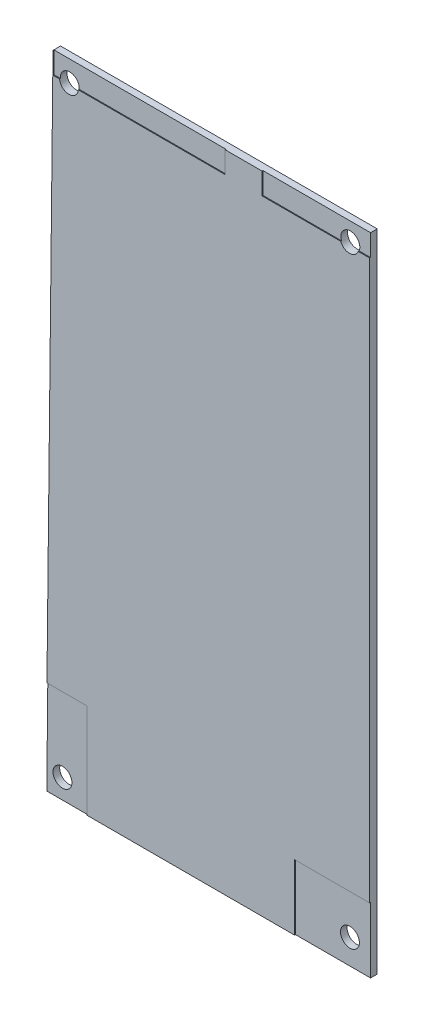
ISO-10303-21;
HEADER;
FILE_DESCRIPTION(('STEP AP214'),'2;1');
FILE_NAME('part.step','',(''),(''),'','','');
FILE_SCHEMA(('AUTOMOTIVE_DESIGN { 1 0 10303 214 1 1 1 1 }'));
ENDSEC;
DATA;
#1=APPLICATION_CONTEXT('core data for automotive mechanical design processes');
#2=APPLICATION_PROTOCOL_DEFINITION('international standard','automotive_design',2000,#1);
#3=PRODUCT_CONTEXT('',#1,'mechanical');
#4=PRODUCT('Part','Part','',(#3));
#5=PRODUCT_RELATED_PRODUCT_CATEGORY('part','',(#4));
#6=PRODUCT_DEFINITION_FORMATION('','',#4);
#7=PRODUCT_DEFINITION_CONTEXT('part definition',#1,'design');
#8=PRODUCT_DEFINITION('design','',#6,#7);
#9=PRODUCT_DEFINITION_SHAPE('','',#8);
#10=(LENGTH_UNIT() NAMED_UNIT(*) SI_UNIT(.MILLI.,.METRE.));
#11=(NAMED_UNIT(*) PLANE_ANGLE_UNIT() SI_UNIT($,.RADIAN.));
#12=(NAMED_UNIT(*) SI_UNIT($,.STERADIAN.) SOLID_ANGLE_UNIT());
#13=UNCERTAINTY_MEASURE_WITH_UNIT(LENGTH_MEASURE(1.E-05),#10,'distance_accuracy_value','');
#14=(GEOMETRIC_REPRESENTATION_CONTEXT(3) GLOBAL_UNCERTAINTY_ASSIGNED_CONTEXT((#13)) GLOBAL_UNIT_ASSIGNED_CONTEXT((#10,
#11,#12)) REPRESENTATION_CONTEXT('',''));
#15=CARTESIAN_POINT('',(0.,0.,0.));
#16=DIRECTION('',(0.,0.,1.));
#17=DIRECTION('',(1.,0.,0.));
#18=AXIS2_PLACEMENT_3D('',#15,#16,#17);
#19=CARTESIAN_POINT('',(1.65,145.,1.55));
#20=DIRECTION('',(0.,-1.,0.));
#21=DIRECTION('',(0.,0.,-1.));
#22=AXIS2_PLACEMENT_3D('',#19,#20,#21);
#23=PLANE('',#22);
#24=DIRECTION('',(1.,0.,0.));
#25=VECTOR('',#24,1.);
#26=CARTESIAN_POINT('',(1.65,145.,1.55));
#27=LINE('',#26,#25);
#28=CARTESIAN_POINT('',(7.54089023002068,145.,1.55));
#29=VERTEX_POINT('',#28);
#30=CARTESIAN_POINT('',(41.65,145.,1.55));
#31=VERTEX_POINT('',#30);
#32=EDGE_CURVE('E319',#29,#31,#27,.T.);
#33=ORIENTED_EDGE('',*,*,#32,.F.);
#34=DIRECTION('',(0.,0.,1.));
#35=VECTOR('',#34,1.);
#36=CARTESIAN_POINT('',(7.54089023002068,145.,0.));
#37=LINE('',#36,#35);
#38=CARTESIAN_POINT('',(7.54089023002068,145.,1.75));
#39=VERTEX_POINT('',#38);
#40=EDGE_CURVE('E58',#29,#39,#37,.T.);
#41=ORIENTED_EDGE('',*,*,#40,.T.);
#42=DIRECTION('',(1.,0.,0.));
#43=VECTOR('',#42,1.);
#44=CARTESIAN_POINT('',(1.65,145.,1.75));
#45=LINE('',#44,#43);
#46=CARTESIAN_POINT('',(41.65,145.,1.75));
#47=VERTEX_POINT('',#46);
#48=EDGE_CURVE('E332',#39,#47,#45,.T.);
#49=ORIENTED_EDGE('',*,*,#48,.T.);
#50=DIRECTION('',(0.,0.,1.));
#51=VECTOR('',#50,1.);
#52=CARTESIAN_POINT('',(41.65,145.,1.55));
#53=LINE('',#52,#51);
#54=EDGE_CURVE('E339',#31,#47,#53,.T.);
#55=ORIENTED_EDGE('',*,*,#54,.F.);
#56=EDGE_LOOP('',(#33,#41,#49,#55));
#57=FACE_BOUND('',#56,.T.);
#58=ADVANCED_FACE('F42',(#57),#23,.F.);
#59=CARTESIAN_POINT('',(75.25,145.,1.55));
#60=DIRECTION('',(0.,-1.,0.));
#61=DIRECTION('',(0.,0.,-1.));
#62=AXIS2_PLACEMENT_3D('',#59,#60,#61);
#63=PLANE('',#62);
#64=DIRECTION('',(1.,0.,0.));
#65=VECTOR('',#64,1.);
#66=CARTESIAN_POINT('',(75.25,145.,1.55));
#67=LINE('',#66,#65);
#68=CARTESIAN_POINT('',(72.5993901531919,145.,1.55));
#69=VERTEX_POINT('',#68);
#70=CARTESIAN_POINT('',(75.25,145.,1.55));
#71=VERTEX_POINT('',#70);
#72=EDGE_CURVE('E348',#69,#71,#67,.T.);
#73=ORIENTED_EDGE('',*,*,#72,.F.);
#74=DIRECTION('',(0.,0.,1.));
#75=VECTOR('',#74,1.);
#76=CARTESIAN_POINT('',(72.5993901531919,145.,0.));
#77=LINE('',#76,#75);
#78=CARTESIAN_POINT('',(72.5993901531919,145.,1.75));
#79=VERTEX_POINT('',#78);
#80=EDGE_CURVE('E66',#69,#79,#77,.T.);
#81=ORIENTED_EDGE('',*,*,#80,.T.);
#82=DIRECTION('',(1.,0.,0.));
#83=VECTOR('',#82,1.);
#84=CARTESIAN_POINT('',(75.25,145.,1.75));
#85=LINE('',#84,#83);
#86=CARTESIAN_POINT('',(75.25,145.,1.75));
#87=VERTEX_POINT('',#86);
#88=EDGE_CURVE('E199',#79,#87,#85,.T.);
#89=ORIENTED_EDGE('',*,*,#88,.T.);
#90=DIRECTION('',(0.,0.,1.));
#91=VECTOR('',#90,1.);
#92=CARTESIAN_POINT('',(75.25,145.,1.55));
#93=LINE('',#92,#91);
#94=EDGE_CURVE('E213',#71,#87,#93,.T.);
#95=ORIENTED_EDGE('',*,*,#94,.F.);
#96=EDGE_LOOP('',(#73,#81,#89,#95));
#97=FACE_BOUND('',#96,.T.);
#98=ADVANCED_FACE('F356',(#97),#63,.F.);
#99=CARTESIAN_POINT('',(1.65,150.,1.75));
#100=DIRECTION('',(0.999939505489822,-0.010999334560388,0.));
#101=DIRECTION('',(0.010999334560388,0.999939505489822,0.));
#102=AXIS2_PLACEMENT_3D('',#99,#100,#101);
#103=PLANE('',#102);
#104=DIRECTION('',(0.010999334560388,0.999939505489822,0.));
#105=VECTOR('',#104,1.);
#106=CARTESIAN_POINT('',(1.65,150.,1.55));
#107=LINE('',#106,#105);
#108=CARTESIAN_POINT('',(0.,0.,1.55));
#109=VERTEX_POINT('',#108);
#110=CARTESIAN_POINT('',(0.241999999999999,22.,1.55));
#111=VERTEX_POINT('',#110);
#112=EDGE_CURVE('E248',#109,#111,#107,.T.);
#113=ORIENTED_EDGE('',*,*,#112,.T.);
#114=DIRECTION('',(0.,0.,1.));
#115=VECTOR('',#114,1.);
#116=CARTESIAN_POINT('',(0.242,22.,1.75));
#117=LINE('',#116,#115);
#118=CARTESIAN_POINT('',(0.242,22.,1.75));
#119=VERTEX_POINT('',#118);
#120=EDGE_CURVE('E242',#111,#119,#117,.T.);
#121=ORIENTED_EDGE('',*,*,#120,.T.);
#122=DIRECTION('',(-0.010999334560388,-0.999939505489821,0.));
#123=VECTOR('',#122,1.);
#124=CARTESIAN_POINT('',(1.65,150.,1.75));
#125=LINE('',#124,#123);
#126=CARTESIAN_POINT('',(1.65,150.,1.75));
#127=VERTEX_POINT('',#126);
#128=EDGE_CURVE('E252',#127,#119,#125,.T.);
#129=ORIENTED_EDGE('',*,*,#128,.F.);
#130=DIRECTION('',(0.,0.,-1.));
#131=VECTOR('',#130,1.);
#132=CARTESIAN_POINT('',(1.65,150.,1.75));
#133=LINE('',#132,#131);
#134=CARTESIAN_POINT('',(1.65,150.,1.55));
#135=VERTEX_POINT('',#134);
#136=EDGE_CURVE('E275',#127,#135,#133,.T.);
#137=ORIENTED_EDGE('',*,*,#136,.T.);
#138=CARTESIAN_POINT('',(1.65,150.,0.));
#139=VERTEX_POINT('',#138);
#140=EDGE_CURVE('E264',#135,#139,#133,.T.);
#141=ORIENTED_EDGE('',*,*,#140,.T.);
#142=DIRECTION('',(-0.010999334560388,-0.999939505489821,0.));
#143=VECTOR('',#142,1.);
#144=CARTESIAN_POINT('',(1.65,150.,0.));
#145=LINE('',#144,#143);
#146=CARTESIAN_POINT('',(0.,0.,0.));
#147=VERTEX_POINT('',#146);
#148=EDGE_CURVE('E251',#139,#147,#145,.T.);
#149=ORIENTED_EDGE('',*,*,#148,.T.);
#150=DIRECTION('',(0.,0.,-1.));
#151=VECTOR('',#150,1.);
#152=CARTESIAN_POINT('',(0.,0.,1.75));
#153=LINE('',#152,#151);
#154=EDGE_CURVE('E282',#109,#147,#153,.T.);
#155=ORIENTED_EDGE('',*,*,#154,.F.);
#156=EDGE_LOOP('',(#113,#121,#129,#137,#141,#149,#155));
#157=FACE_BOUND('',#156,.T.);
#158=ADVANCED_FACE('F44',(#157),#103,.F.);
#159=CARTESIAN_POINT('',(0.,0.,1.75));
#160=DIRECTION('',(0.,1.,0.));
#161=DIRECTION('',(0.,0.,1.));
#162=AXIS2_PLACEMENT_3D('',#159,#160,#161);
#163=PLANE('',#162);
#164=DIRECTION('',(1.,0.,0.));
#165=VECTOR('',#164,1.);
#166=CARTESIAN_POINT('',(0.,0.,1.75));
#167=LINE('',#166,#165);
#168=CARTESIAN_POINT('',(9.5,0.,1.75));
#169=VERTEX_POINT('',#168);
#170=CARTESIAN_POINT('',(57.75,0.,1.75));
#171=VERTEX_POINT('',#170);
#172=EDGE_CURVE('E255',#169,#171,#167,.T.);
#173=ORIENTED_EDGE('',*,*,#172,.F.);
#174=DIRECTION('',(0.,0.,1.));
#175=VECTOR('',#174,1.);
#176=CARTESIAN_POINT('',(9.5,0.,1.55));
#177=LINE('',#176,#175);
#178=CARTESIAN_POINT('',(9.5,0.,1.55));
#179=VERTEX_POINT('',#178);
#180=EDGE_CURVE('E308',#179,#169,#177,.T.);
#181=ORIENTED_EDGE('',*,*,#180,.F.);
#182=DIRECTION('',(1.,0.,0.));
#183=VECTOR('',#182,1.);
#184=CARTESIAN_POINT('',(0.,0.,1.55));
#185=LINE('',#184,#183);
#186=EDGE_CURVE('E298',#109,#179,#185,.T.);
#187=ORIENTED_EDGE('',*,*,#186,.F.);
#188=ORIENTED_EDGE('',*,*,#154,.T.);
#189=DIRECTION('',(1.,0.,0.));
#190=VECTOR('',#189,1.);
#191=CARTESIAN_POINT('',(0.,0.,0.));
#192=LINE('',#191,#190);
#193=CARTESIAN_POINT('',(75.25,0.,0.));
#194=VERTEX_POINT('',#193);
#195=EDGE_CURVE('E267',#147,#194,#192,.T.);
#196=ORIENTED_EDGE('',*,*,#195,.T.);
#197=DIRECTION('',(0.,0.,-1.));
#198=VECTOR('',#197,1.);
#199=CARTESIAN_POINT('',(75.25,0.,1.75));
#200=LINE('',#199,#198);
#201=CARTESIAN_POINT('',(75.25,0.,1.55));
#202=VERTEX_POINT('',#201);
#203=EDGE_CURVE('E280',#202,#194,#200,.T.);
#204=ORIENTED_EDGE('',*,*,#203,.F.);
#205=DIRECTION('',(1.,0.,0.));
#206=VECTOR('',#205,1.);
#207=CARTESIAN_POINT('',(75.25,0.,1.55));
#208=LINE('',#207,#206);
#209=CARTESIAN_POINT('',(57.75,0.,1.55));
#210=VERTEX_POINT('',#209);
#211=EDGE_CURVE('E231',#210,#202,#208,.T.);
#212=ORIENTED_EDGE('',*,*,#211,.F.);
#213=DIRECTION('',(0.,0.,1.));
#214=VECTOR('',#213,1.);
#215=CARTESIAN_POINT('',(57.75,0.,1.55));
#216=LINE('',#215,#214);
#217=EDGE_CURVE('E239',#210,#171,#216,.T.);
#218=ORIENTED_EDGE('',*,*,#217,.T.);
#219=EDGE_LOOP('',(#173,#181,#187,#188,#196,#204,#212,#218));
#220=FACE_BOUND('',#219,.T.);
#221=ADVANCED_FACE('F406',(#220),#163,.F.);
#222=CARTESIAN_POINT('',(75.25,0.,1.75));
#223=DIRECTION('',(-1.,0.,0.));
#224=DIRECTION('',(0.,0.,1.));
#225=AXIS2_PLACEMENT_3D('',#222,#223,#224);
#226=PLANE('',#225);
#227=DIRECTION('',(0.,1.,0.));
#228=VECTOR('',#227,1.);
#229=CARTESIAN_POINT('',(75.25,150.,1.55));
#230=LINE('',#229,#228);
#231=CARTESIAN_POINT('',(75.25,150.,1.55));
#232=VERTEX_POINT('',#231);
#233=EDGE_CURVE('E205',#71,#232,#230,.T.);
#234=ORIENTED_EDGE('',*,*,#233,.F.);
#235=ORIENTED_EDGE('',*,*,#94,.T.);
#236=DIRECTION('',(0.,1.,0.));
#237=VECTOR('',#236,1.);
#238=CARTESIAN_POINT('',(75.25,0.,1.75));
#239=LINE('',#238,#237);
#240=CARTESIAN_POINT('',(75.25,15.2,1.75));
#241=VERTEX_POINT('',#240);
#242=EDGE_CURVE('E259',#241,#87,#239,.T.);
#243=ORIENTED_EDGE('',*,*,#242,.F.);
#244=DIRECTION('',(0.,0.,1.));
#245=VECTOR('',#244,1.);
#246=CARTESIAN_POINT('',(75.25,15.2,1.55));
#247=LINE('',#246,#245);
#248=CARTESIAN_POINT('',(75.25,15.2,1.55));
#249=VERTEX_POINT('',#248);
#250=EDGE_CURVE('E233',#249,#241,#247,.T.);
#251=ORIENTED_EDGE('',*,*,#250,.F.);
#252=DIRECTION('',(0.,1.,0.));
#253=VECTOR('',#252,1.);
#254=CARTESIAN_POINT('',(75.25,0.,1.55));
#255=LINE('',#254,#253);
#256=EDGE_CURVE('E221',#202,#249,#255,.T.);
#257=ORIENTED_EDGE('',*,*,#256,.F.);
#258=ORIENTED_EDGE('',*,*,#203,.T.);
#259=DIRECTION('',(0.,1.,0.));
#260=VECTOR('',#259,1.);
#261=CARTESIAN_POINT('',(75.25,0.,0.));
#262=LINE('',#261,#260);
#263=CARTESIAN_POINT('',(75.25,150.,0.));
#264=VERTEX_POINT('',#263);
#265=EDGE_CURVE('E270',#194,#264,#262,.T.);
#266=ORIENTED_EDGE('',*,*,#265,.T.);
#267=DIRECTION('',(0.,0.,-1.));
#268=VECTOR('',#267,1.);
#269=CARTESIAN_POINT('',(75.25,150.,1.75));
#270=LINE('',#269,#268);
#271=EDGE_CURVE('E278',#232,#264,#270,.T.);
#272=ORIENTED_EDGE('',*,*,#271,.F.);
#273=EDGE_LOOP('',(#234,#235,#243,#251,#257,#258,#266,#272));
#274=FACE_BOUND('',#273,.T.);
#275=ADVANCED_FACE('F360',(#274),#226,.F.);
#276=CARTESIAN_POINT('',(75.25,150.,1.75));
#277=DIRECTION('',(0.,-1.,0.));
#278=DIRECTION('',(0.,0.,-1.));
#279=AXIS2_PLACEMENT_3D('',#276,#277,#278);
#280=PLANE('',#279);
#281=DIRECTION('',(-1.,0.,0.));
#282=VECTOR('',#281,1.);
#283=CARTESIAN_POINT('',(75.25,150.,1.75));
#284=LINE('',#283,#282);
#285=CARTESIAN_POINT('',(50.25,150.,1.75));
#286=VERTEX_POINT('',#285);
#287=CARTESIAN_POINT('',(41.65,150.,1.75));
#288=VERTEX_POINT('',#287);
#289=EDGE_CURVE('E261',#286,#288,#284,.T.);
#290=ORIENTED_EDGE('',*,*,#289,.F.);
#291=DIRECTION('',(0.,0.,1.));
#292=VECTOR('',#291,1.);
#293=CARTESIAN_POINT('',(50.25,150.,1.55));
#294=LINE('',#293,#292);
#295=CARTESIAN_POINT('',(50.25,150.,1.55));
#296=VERTEX_POINT('',#295);
#297=EDGE_CURVE('E218',#296,#286,#294,.T.);
#298=ORIENTED_EDGE('',*,*,#297,.F.);
#299=DIRECTION('',(-1.,0.,0.));
#300=VECTOR('',#299,1.);
#301=CARTESIAN_POINT('',(75.25,150.,1.55));
#302=LINE('',#301,#300);
#303=EDGE_CURVE('E207',#232,#296,#302,.T.);
#304=ORIENTED_EDGE('',*,*,#303,.F.);
#305=ORIENTED_EDGE('',*,*,#271,.T.);
#306=DIRECTION('',(-1.,0.,0.));
#307=VECTOR('',#306,1.);
#308=CARTESIAN_POINT('',(75.25,150.,0.));
#309=LINE('',#308,#307);
#310=EDGE_CURVE('E256',#264,#139,#309,.T.);
#311=ORIENTED_EDGE('',*,*,#310,.T.);
#312=ORIENTED_EDGE('',*,*,#140,.F.);
#313=DIRECTION('',(-1.,0.,0.));
#314=VECTOR('',#313,1.);
#315=CARTESIAN_POINT('',(1.65,150.,1.55));
#316=LINE('',#315,#314);
#317=CARTESIAN_POINT('',(41.65,150.,1.55));
#318=VERTEX_POINT('',#317);
#319=EDGE_CURVE('E327',#318,#135,#316,.T.);
#320=ORIENTED_EDGE('',*,*,#319,.F.);
#321=DIRECTION('',(0.,0.,1.));
#322=VECTOR('',#321,1.);
#323=CARTESIAN_POINT('',(41.65,150.,1.55));
#324=LINE('',#323,#322);
#325=EDGE_CURVE('E312',#318,#288,#324,.T.);
#326=ORIENTED_EDGE('',*,*,#325,.T.);
#327=EDGE_LOOP('',(#290,#298,#304,#305,#311,#312,#320,#326));
#328=FACE_BOUND('',#327,.T.);
#329=ADVANCED_FACE('F365',(#328),#280,.F.);
#330=CARTESIAN_POINT('',(0.,0.,1.75));
#331=DIRECTION('',(0.,0.,1.));
#332=DIRECTION('',(1.,0.,0.));
#333=AXIS2_PLACEMENT_3D('',#330,#331,#332);
#334=PLANE('',#333);
#335=CARTESIAN_POINT('',(5.35,145.2,1.75));
#336=DIRECTION('',(0.,0.,1.));
#337=DIRECTION('',(1.,0.,0.));
#338=AXIS2_PLACEMENT_3D('',#335,#336,#337);
#339=CIRCLE('',#338,2.20000000000002);
#340=CARTESIAN_POINT('',(3.15910976997932,145.,1.75));
#341=VERTEX_POINT('',#340);
#342=EDGE_CURVE('E380',#341,#39,#339,.T.);
#343=ORIENTED_EDGE('',*,*,#342,.F.);
#344=CARTESIAN_POINT('',(1.65,145.,1.75));
#345=VERTEX_POINT('',#344);
#346=EDGE_CURVE('E333',#345,#341,#45,.T.);
#347=ORIENTED_EDGE('',*,*,#346,.F.);
#348=DIRECTION('',(0.,-1.,0.));
#349=VECTOR('',#348,1.);
#350=CARTESIAN_POINT('',(1.65,150.,1.75));
#351=LINE('',#350,#349);
#352=EDGE_CURVE('E216',#127,#345,#351,.T.);
#353=ORIENTED_EDGE('',*,*,#352,.F.);
#354=ORIENTED_EDGE('',*,*,#128,.T.);
#355=DIRECTION('',(-1.,0.,0.));
#356=VECTOR('',#355,1.);
#357=CARTESIAN_POINT('',(0.,22.,1.75));
#358=LINE('',#357,#356);
#359=CARTESIAN_POINT('',(9.5,22.,1.75));
#360=VERTEX_POINT('',#359);
#361=EDGE_CURVE('E302',#360,#119,#358,.T.);
#362=ORIENTED_EDGE('',*,*,#361,.F.);
#363=DIRECTION('',(0.,1.,0.));
#364=VECTOR('',#363,1.);
#365=CARTESIAN_POINT('',(9.5,0.,1.75));
#366=LINE('',#365,#364);
#367=EDGE_CURVE('E309',#169,#360,#366,.T.);
#368=ORIENTED_EDGE('',*,*,#367,.F.);
#369=ORIENTED_EDGE('',*,*,#172,.T.);
#370=DIRECTION('',(0.,-1.,0.));
#371=VECTOR('',#370,1.);
#372=CARTESIAN_POINT('',(57.75,0.,1.75));
#373=LINE('',#372,#371);
#374=CARTESIAN_POINT('',(57.75,15.2,1.75));
#375=VERTEX_POINT('',#374);
#376=EDGE_CURVE('E225',#375,#171,#373,.T.);
#377=ORIENTED_EDGE('',*,*,#376,.F.);
#378=DIRECTION('',(-1.,0.,0.));
#379=VECTOR('',#378,1.);
#380=CARTESIAN_POINT('',(75.25,15.2,1.75));
#381=LINE('',#380,#379);
#382=EDGE_CURVE('E234',#241,#375,#381,.T.);
#383=ORIENTED_EDGE('',*,*,#382,.F.);
#384=ORIENTED_EDGE('',*,*,#242,.T.);
#385=ORIENTED_EDGE('',*,*,#88,.F.);
#386=CARTESIAN_POINT('',(70.55,145.8,1.75));
#387=DIRECTION('',(0.,0.,1.));
#388=DIRECTION('',(1.,0.,0.));
#389=AXIS2_PLACEMENT_3D('',#386,#387,#388);
#390=CIRCLE('',#389,2.2);
#391=CARTESIAN_POINT('',(68.5006098468081,145.,1.75));
#392=VERTEX_POINT('',#391);
#393=EDGE_CURVE('E184',#392,#79,#390,.T.);
#394=ORIENTED_EDGE('',*,*,#393,.F.);
#395=CARTESIAN_POINT('',(50.25,145.,1.75));
#396=VERTEX_POINT('',#395);
#397=EDGE_CURVE('E197',#396,#392,#85,.T.);
#398=ORIENTED_EDGE('',*,*,#397,.F.);
#399=DIRECTION('',(0.,-1.,0.));
#400=VECTOR('',#399,1.);
#401=CARTESIAN_POINT('',(50.25,150.,1.75));
#402=LINE('',#401,#400);
#403=EDGE_CURVE('E209',#286,#396,#402,.T.);
#404=ORIENTED_EDGE('',*,*,#403,.F.);
#405=ORIENTED_EDGE('',*,*,#289,.T.);
#406=DIRECTION('',(0.,1.,0.));
#407=VECTOR('',#406,1.);
#408=CARTESIAN_POINT('',(41.65,150.,1.75));
#409=LINE('',#408,#407);
#410=EDGE_CURVE('E320',#47,#288,#409,.T.);
#411=ORIENTED_EDGE('',*,*,#410,.F.);
#412=ORIENTED_EDGE('',*,*,#48,.F.);
#413=EDGE_LOOP('',(#343,#347,#353,#354,#362,#368,#369,#377,#383,#384,#385,#394,#398,#404,#405,
#411,#412));
#414=FACE_BOUND('',#413,.T.);
#415=ADVANCED_FACE('F195',(#414),#334,.T.);
#416=CARTESIAN_POINT('',(0.,0.,0.));
#417=DIRECTION('',(0.,0.,1.));
#418=DIRECTION('',(1.,0.,0.));
#419=AXIS2_PLACEMENT_3D('',#416,#417,#418);
#420=PLANE('',#419);
#421=CARTESIAN_POINT('',(70.45,5.8,0.));
#422=DIRECTION('',(0.,0.,1.));
#423=DIRECTION('',(1.,0.,0.));
#424=AXIS2_PLACEMENT_3D('',#421,#422,#423);
#425=CIRCLE('',#424,2.2);
#426=CARTESIAN_POINT('',(72.65,5.8,0.));
#427=VERTEX_POINT('',#426);
#428=EDGE_CURVE('E484',#427,#427,#425,.T.);
#429=ORIENTED_EDGE('',*,*,#428,.T.);
#430=EDGE_LOOP('',(#429));
#431=FACE_BOUND('',#430,.T.);
#432=CARTESIAN_POINT('',(5.35,145.2,0.));
#433=DIRECTION('',(0.,0.,1.));
#434=DIRECTION('',(1.,0.,0.));
#435=AXIS2_PLACEMENT_3D('',#432,#433,#434);
#436=CIRCLE('',#435,2.20000000000002);
#437=CARTESIAN_POINT('',(7.55000000000002,145.2,0.));
#438=VERTEX_POINT('',#437);
#439=EDGE_CURVE('E382',#438,#438,#436,.T.);
#440=ORIENTED_EDGE('',*,*,#439,.T.);
#441=EDGE_LOOP('',(#440));
#442=FACE_BOUND('',#441,.T.);
#443=CARTESIAN_POINT('',(70.55,145.8,0.));
#444=DIRECTION('',(0.,0.,1.));
#445=DIRECTION('',(1.,0.,0.));
#446=AXIS2_PLACEMENT_3D('',#443,#444,#445);
#447=CIRCLE('',#446,2.2);
#448=CARTESIAN_POINT('',(72.75,145.8,0.));
#449=VERTEX_POINT('',#448);
#450=EDGE_CURVE('E200',#449,#449,#447,.T.);
#451=ORIENTED_EDGE('',*,*,#450,.T.);
#452=EDGE_LOOP('',(#451));
#453=FACE_BOUND('',#452,.T.);
#454=CARTESIAN_POINT('',(3.65081779341195,4.6,0.));
#455=DIRECTION('',(0.,0.,1.));
#456=DIRECTION('',(1.,0.,0.));
#457=AXIS2_PLACEMENT_3D('',#454,#455,#456);
#458=CIRCLE('',#457,2.2);
#459=CARTESIAN_POINT('',(5.85081779341195,4.6,0.));
#460=VERTEX_POINT('',#459);
#461=EDGE_CURVE('E189',#460,#460,#458,.T.);
#462=ORIENTED_EDGE('',*,*,#461,.T.);
#463=EDGE_LOOP('',(#462));
#464=FACE_BOUND('',#463,.T.);
#465=ORIENTED_EDGE('',*,*,#148,.F.);
#466=ORIENTED_EDGE('',*,*,#310,.F.);
#467=ORIENTED_EDGE('',*,*,#265,.F.);
#468=ORIENTED_EDGE('',*,*,#195,.F.);
#469=EDGE_LOOP('',(#465,#466,#467,#468));
#470=FACE_BOUND('',#469,.T.);
#471=ADVANCED_FACE('F421',(#431,#442,#453,#464,#470),#420,.F.);
#472=CARTESIAN_POINT('',(57.75,0.,1.55));
#473=DIRECTION('',(-1.,0.,0.));
#474=DIRECTION('',(0.,-1.,0.));
#475=AXIS2_PLACEMENT_3D('',#472,#473,#474);
#476=PLANE('',#475);
#477=ORIENTED_EDGE('',*,*,#376,.T.);
#478=ORIENTED_EDGE('',*,*,#217,.F.);
#479=DIRECTION('',(0.,-1.,0.));
#480=VECTOR('',#479,1.);
#481=CARTESIAN_POINT('',(57.75,0.,1.55));
#482=LINE('',#481,#480);
#483=CARTESIAN_POINT('',(57.75,15.2,1.55));
#484=VERTEX_POINT('',#483);
#485=EDGE_CURVE('E228',#484,#210,#482,.T.);
#486=ORIENTED_EDGE('',*,*,#485,.F.);
#487=DIRECTION('',(0.,0.,1.));
#488=VECTOR('',#487,1.);
#489=CARTESIAN_POINT('',(57.75,15.2,1.55));
#490=LINE('',#489,#488);
#491=EDGE_CURVE('E243',#484,#375,#490,.T.);
#492=ORIENTED_EDGE('',*,*,#491,.T.);
#493=EDGE_LOOP('',(#477,#478,#486,#492));
#494=FACE_BOUND('',#493,.T.);
#495=ADVANCED_FACE('F411',(#494),#476,.F.);
#496=CARTESIAN_POINT('',(75.25,15.2,1.55));
#497=DIRECTION('',(0.,1.,0.));
#498=DIRECTION('',(-1.,0.,0.));
#499=AXIS2_PLACEMENT_3D('',#496,#497,#498);
#500=PLANE('',#499);
#501=ORIENTED_EDGE('',*,*,#382,.T.);
#502=ORIENTED_EDGE('',*,*,#491,.F.);
#503=DIRECTION('',(-1.,0.,0.));
#504=VECTOR('',#503,1.);
#505=CARTESIAN_POINT('',(75.25,15.2,1.55));
#506=LINE('',#505,#504);
#507=EDGE_CURVE('E224',#249,#484,#506,.T.);
#508=ORIENTED_EDGE('',*,*,#507,.F.);
#509=ORIENTED_EDGE('',*,*,#250,.T.);
#510=EDGE_LOOP('',(#501,#502,#508,#509));
#511=FACE_BOUND('',#510,.T.);
#512=ADVANCED_FACE('F417',(#511),#500,.F.);
#513=CARTESIAN_POINT('',(0.,0.,1.55));
#514=DIRECTION('',(0.,0.,1.));
#515=DIRECTION('',(1.,0.,0.));
#516=AXIS2_PLACEMENT_3D('',#513,#514,#515);
#517=PLANE('',#516);
#518=CARTESIAN_POINT('',(70.45,5.8,1.55));
#519=DIRECTION('',(0.,0.,1.));
#520=DIRECTION('',(1.,0.,0.));
#521=AXIS2_PLACEMENT_3D('',#518,#519,#520);
#522=CIRCLE('',#521,2.2);
#523=CARTESIAN_POINT('',(72.65,5.8,1.55));
#524=VERTEX_POINT('',#523);
#525=EDGE_CURVE('E46',#524,#524,#522,.T.);
#526=ORIENTED_EDGE('',*,*,#525,.F.);
#527=EDGE_LOOP('',(#526));
#528=FACE_BOUND('',#527,.T.);
#529=ORIENTED_EDGE('',*,*,#256,.T.);
#530=ORIENTED_EDGE('',*,*,#507,.T.);
#531=ORIENTED_EDGE('',*,*,#485,.T.);
#532=ORIENTED_EDGE('',*,*,#211,.T.);
#533=EDGE_LOOP('',(#529,#530,#531,#532));
#534=FACE_BOUND('',#533,.T.);
#535=ADVANCED_FACE('F413',(#528,#534),#517,.T.);
#536=CARTESIAN_POINT('',(0.,0.,1.55));
#537=DIRECTION('',(0.,0.,-1.));
#538=DIRECTION('',(-1.,0.,0.));
#539=AXIS2_PLACEMENT_3D('',#536,#537,#538);
#540=PLANE('',#539);
#541=CARTESIAN_POINT('',(3.65081779341195,4.6,1.55));
#542=DIRECTION('',(0.,0.,-1.));
#543=DIRECTION('',(-1.,0.,0.));
#544=AXIS2_PLACEMENT_3D('',#541,#542,#543);
#545=CIRCLE('',#544,2.2);
#546=CARTESIAN_POINT('',(5.85081779341195,4.6,1.55));
#547=VERTEX_POINT('',#546);
#548=EDGE_CURVE('E284',#547,#547,#545,.T.);
#549=ORIENTED_EDGE('',*,*,#548,.T.);
#550=EDGE_LOOP('',(#549));
#551=FACE_BOUND('',#550,.T.);
#552=ORIENTED_EDGE('',*,*,#186,.T.);
#553=DIRECTION('',(0.,1.,0.));
#554=VECTOR('',#553,1.);
#555=CARTESIAN_POINT('',(9.5,0.,1.55));
#556=LINE('',#555,#554);
#557=CARTESIAN_POINT('',(9.5,22.,1.55));
#558=VERTEX_POINT('',#557);
#559=EDGE_CURVE('E301',#179,#558,#556,.T.);
#560=ORIENTED_EDGE('',*,*,#559,.T.);
#561=DIRECTION('',(-1.,0.,0.));
#562=VECTOR('',#561,1.);
#563=CARTESIAN_POINT('',(0.,22.,1.55));
#564=LINE('',#563,#562);
#565=EDGE_CURVE('E305',#558,#111,#564,.T.);
#566=ORIENTED_EDGE('',*,*,#565,.T.);
#567=ORIENTED_EDGE('',*,*,#112,.F.);
#568=EDGE_LOOP('',(#552,#560,#566,#567));
#569=FACE_BOUND('',#568,.T.);
#570=ADVANCED_FACE('F397',(#551,#569),#540,.F.);
#571=CARTESIAN_POINT('',(0.,22.,1.55));
#572=DIRECTION('',(0.,1.,0.));
#573=DIRECTION('',(0.,0.,1.));
#574=AXIS2_PLACEMENT_3D('',#571,#572,#573);
#575=PLANE('',#574);
#576=ORIENTED_EDGE('',*,*,#565,.F.);
#577=DIRECTION('',(0.,0.,1.));
#578=VECTOR('',#577,1.);
#579=CARTESIAN_POINT('',(9.5,22.,1.55));
#580=LINE('',#579,#578);
#581=EDGE_CURVE('E237',#558,#360,#580,.T.);
#582=ORIENTED_EDGE('',*,*,#581,.T.);
#583=ORIENTED_EDGE('',*,*,#361,.T.);
#584=ORIENTED_EDGE('',*,*,#120,.F.);
#585=EDGE_LOOP('',(#576,#582,#583,#584));
#586=FACE_BOUND('',#585,.T.);
#587=ADVANCED_FACE('F395',(#586),#575,.F.);
#588=CARTESIAN_POINT('',(9.5,0.,1.55));
#589=DIRECTION('',(1.,0.,0.));
#590=DIRECTION('',(0.,0.,-1.));
#591=AXIS2_PLACEMENT_3D('',#588,#589,#590);
#592=PLANE('',#591);
#593=ORIENTED_EDGE('',*,*,#367,.T.);
#594=ORIENTED_EDGE('',*,*,#581,.F.);
#595=ORIENTED_EDGE('',*,*,#559,.F.);
#596=ORIENTED_EDGE('',*,*,#180,.T.);
#597=EDGE_LOOP('',(#593,#594,#595,#596));
#598=FACE_BOUND('',#597,.T.);
#599=ADVANCED_FACE('F401',(#598),#592,.F.);
#600=CARTESIAN_POINT('',(1.65,150.,1.55));
#601=DIRECTION('',(-1.,0.,0.));
#602=DIRECTION('',(0.,-1.,0.));
#603=AXIS2_PLACEMENT_3D('',#600,#601,#602);
#604=PLANE('',#603);
#605=ORIENTED_EDGE('',*,*,#352,.T.);
#606=DIRECTION('',(0.,0.,1.));
#607=VECTOR('',#606,1.);
#608=CARTESIAN_POINT('',(1.65,145.,1.55));
#609=LINE('',#608,#607);
#610=CARTESIAN_POINT('',(1.65,145.,1.55));
#611=VERTEX_POINT('',#610);
#612=EDGE_CURVE('E330',#611,#345,#609,.T.);
#613=ORIENTED_EDGE('',*,*,#612,.F.);
#614=DIRECTION('',(0.,-1.,0.));
#615=VECTOR('',#614,1.);
#616=CARTESIAN_POINT('',(1.65,150.,1.55));
#617=LINE('',#616,#615);
#618=EDGE_CURVE('E316',#135,#611,#617,.T.);
#619=ORIENTED_EDGE('',*,*,#618,.F.);
#620=ORIENTED_EDGE('',*,*,#136,.F.);
#621=EDGE_LOOP('',(#605,#613,#619,#620));
#622=FACE_BOUND('',#621,.T.);
#623=ADVANCED_FACE('F388',(#622),#604,.F.);
#624=CARTESIAN_POINT('',(41.65,150.,1.55));
#625=DIRECTION('',(1.,0.,0.));
#626=DIRECTION('',(0.,0.,-1.));
#627=AXIS2_PLACEMENT_3D('',#624,#625,#626);
#628=PLANE('',#627);
#629=ORIENTED_EDGE('',*,*,#410,.T.);
#630=ORIENTED_EDGE('',*,*,#325,.F.);
#631=DIRECTION('',(0.,1.,0.));
#632=VECTOR('',#631,1.);
#633=CARTESIAN_POINT('',(41.65,150.,1.55));
#634=LINE('',#633,#632);
#635=EDGE_CURVE('E324',#31,#318,#634,.T.);
#636=ORIENTED_EDGE('',*,*,#635,.F.);
#637=ORIENTED_EDGE('',*,*,#54,.T.);
#638=EDGE_LOOP('',(#629,#630,#636,#637));
#639=FACE_BOUND('',#638,.T.);
#640=ADVANCED_FACE('F375',(#639),#628,.F.);
#641=ORIENTED_EDGE('',*,*,#346,.T.);
#642=DIRECTION('',(0.,0.,1.));
#643=VECTOR('',#642,1.);
#644=CARTESIAN_POINT('',(3.15910976997932,145.,0.));
#645=LINE('',#644,#643);
#646=CARTESIAN_POINT('',(3.15910976997932,145.,1.55));
#647=VERTEX_POINT('',#646);
#648=EDGE_CURVE('E289',#341,#647,#645,.F.);
#649=ORIENTED_EDGE('',*,*,#648,.T.);
#650=EDGE_CURVE('E321',#611,#647,#27,.T.);
#651=ORIENTED_EDGE('',*,*,#650,.F.);
#652=ORIENTED_EDGE('',*,*,#612,.T.);
#653=EDGE_LOOP('',(#641,#649,#651,#652));
#654=FACE_BOUND('',#653,.T.);
#655=ADVANCED_FACE('F385',(#654),#23,.F.);
#656=CARTESIAN_POINT('',(0.,0.,1.55));
#657=DIRECTION('',(0.,0.,1.));
#658=DIRECTION('',(1.,0.,0.));
#659=AXIS2_PLACEMENT_3D('',#656,#657,#658);
#660=PLANE('',#659);
#661=CARTESIAN_POINT('',(5.35,145.2,1.55));
#662=DIRECTION('',(0.,0.,1.));
#663=DIRECTION('',(1.,0.,0.));
#664=AXIS2_PLACEMENT_3D('',#661,#662,#663);
#665=CIRCLE('',#664,2.20000000000002);
#666=EDGE_CURVE('E11',#29,#647,#665,.T.);
#667=ORIENTED_EDGE('',*,*,#666,.F.);
#668=ORIENTED_EDGE('',*,*,#32,.T.);
#669=ORIENTED_EDGE('',*,*,#635,.T.);
#670=ORIENTED_EDGE('',*,*,#319,.T.);
#671=ORIENTED_EDGE('',*,*,#618,.T.);
#672=ORIENTED_EDGE('',*,*,#650,.T.);
#673=EDGE_LOOP('',(#667,#668,#669,#670,#671,#672));
#674=FACE_BOUND('',#673,.T.);
#675=ADVANCED_FACE('F377',(#674),#660,.T.);
#676=ORIENTED_EDGE('',*,*,#397,.T.);
#677=DIRECTION('',(0.,0.,1.));
#678=VECTOR('',#677,1.);
#679=CARTESIAN_POINT('',(68.5006098468081,145.,0.));
#680=LINE('',#679,#678);
#681=CARTESIAN_POINT('',(68.5006098468081,145.,1.55));
#682=VERTEX_POINT('',#681);
#683=EDGE_CURVE('E181',#392,#682,#680,.F.);
#684=ORIENTED_EDGE('',*,*,#683,.T.);
#685=CARTESIAN_POINT('',(50.25,145.,1.55));
#686=VERTEX_POINT('',#685);
#687=EDGE_CURVE('E220',#686,#682,#67,.T.);
#688=ORIENTED_EDGE('',*,*,#687,.F.);
#689=DIRECTION('',(0.,0.,1.));
#690=VECTOR('',#689,1.);
#691=CARTESIAN_POINT('',(50.25,145.,1.55));
#692=LINE('',#691,#690);
#693=EDGE_CURVE('E203',#686,#396,#692,.T.);
#694=ORIENTED_EDGE('',*,*,#693,.T.);
#695=EDGE_LOOP('',(#676,#684,#688,#694));
#696=FACE_BOUND('',#695,.T.);
#697=ADVANCED_FACE('F202',(#696),#63,.F.);
#698=CARTESIAN_POINT('',(50.25,150.,1.55));
#699=DIRECTION('',(-1.,0.,0.));
#700=DIRECTION('',(0.,0.,1.));
#701=AXIS2_PLACEMENT_3D('',#698,#699,#700);
#702=PLANE('',#701);
#703=ORIENTED_EDGE('',*,*,#403,.T.);
#704=ORIENTED_EDGE('',*,*,#693,.F.);
#705=DIRECTION('',(0.,-1.,0.));
#706=VECTOR('',#705,1.);
#707=CARTESIAN_POINT('',(50.25,150.,1.55));
#708=LINE('',#707,#706);
#709=EDGE_CURVE('E346',#296,#686,#708,.T.);
#710=ORIENTED_EDGE('',*,*,#709,.F.);
#711=ORIENTED_EDGE('',*,*,#297,.T.);
#712=EDGE_LOOP('',(#703,#704,#710,#711));
#713=FACE_BOUND('',#712,.T.);
#714=ADVANCED_FACE('F370',(#713),#702,.F.);
#715=CARTESIAN_POINT('',(0.,0.,1.55));
#716=DIRECTION('',(0.,0.,-1.));
#717=DIRECTION('',(-1.,0.,0.));
#718=AXIS2_PLACEMENT_3D('',#715,#716,#717);
#719=PLANE('',#718);
#720=ORIENTED_EDGE('',*,*,#687,.T.);
#721=CARTESIAN_POINT('',(70.55,145.8,1.55));
#722=DIRECTION('',(0.,0.,-1.));
#723=DIRECTION('',(-1.,0.,0.));
#724=AXIS2_PLACEMENT_3D('',#721,#722,#723);
#725=CIRCLE('',#724,2.2);
#726=EDGE_CURVE('E51',#682,#69,#725,.T.);
#727=ORIENTED_EDGE('',*,*,#726,.T.);
#728=ORIENTED_EDGE('',*,*,#72,.T.);
#729=ORIENTED_EDGE('',*,*,#233,.T.);
#730=ORIENTED_EDGE('',*,*,#303,.T.);
#731=ORIENTED_EDGE('',*,*,#709,.T.);
#732=EDGE_LOOP('',(#720,#727,#728,#729,#730,#731));
#733=FACE_BOUND('',#732,.T.);
#734=ADVANCED_FACE('F352',(#733),#719,.F.);
#735=CARTESIAN_POINT('',(70.55,145.8,0.));
#736=DIRECTION('',(0.,0.,1.));
#737=DIRECTION('',(1.,0.,0.));
#738=AXIS2_PLACEMENT_3D('',#735,#736,#737);
#739=CYLINDRICAL_SURFACE('',#738,2.2);
#740=ORIENTED_EDGE('',*,*,#450,.F.);
#741=EDGE_LOOP('',(#740));
#742=FACE_BOUND('',#741,.T.);
#743=ORIENTED_EDGE('',*,*,#726,.F.);
#744=ORIENTED_EDGE('',*,*,#683,.F.);
#745=ORIENTED_EDGE('',*,*,#393,.T.);
#746=ORIENTED_EDGE('',*,*,#80,.F.);
#747=EDGE_LOOP('',(#743,#744,#745,#746));
#748=FACE_BOUND('',#747,.T.);
#749=ADVANCED_FACE('F183',(#742,#748),#739,.F.);
#750=CARTESIAN_POINT('',(5.35,145.2,0.));
#751=DIRECTION('',(0.,0.,1.));
#752=DIRECTION('',(1.,0.,0.));
#753=AXIS2_PLACEMENT_3D('',#750,#751,#752);
#754=CYLINDRICAL_SURFACE('',#753,2.20000000000002);
#755=ORIENTED_EDGE('',*,*,#439,.F.);
#756=EDGE_LOOP('',(#755));
#757=FACE_BOUND('',#756,.T.);
#758=ORIENTED_EDGE('',*,*,#666,.T.);
#759=ORIENTED_EDGE('',*,*,#648,.F.);
#760=ORIENTED_EDGE('',*,*,#342,.T.);
#761=ORIENTED_EDGE('',*,*,#40,.F.);
#762=EDGE_LOOP('',(#758,#759,#760,#761));
#763=FACE_BOUND('',#762,.T.);
#764=ADVANCED_FACE('F464',(#757,#763),#754,.F.);
#765=CARTESIAN_POINT('',(3.65081779341195,4.6,0.));
#766=DIRECTION('',(0.,0.,1.));
#767=DIRECTION('',(1.,0.,0.));
#768=AXIS2_PLACEMENT_3D('',#765,#766,#767);
#769=CYLINDRICAL_SURFACE('',#768,2.2);
#770=CARTESIAN_POINT('',(5.85081779341195,4.6,0.));
#771=CARTESIAN_POINT('',(5.85081779341195,4.6,0.0161458333333333));
#772=CARTESIAN_POINT('',(5.85081779341195,4.6,0.0322916666666667));
#773=CARTESIAN_POINT('',(5.85081779341195,4.6,0.0645833333333333));
#774=CARTESIAN_POINT('',(5.85081779341195,4.6,0.0807291666666667));
#775=CARTESIAN_POINT('',(5.85081779341195,4.6,0.113020833333333));
#776=CARTESIAN_POINT('',(5.85081779341195,4.6,0.129166666666667));
#777=CARTESIAN_POINT('',(5.85081779341195,4.6,0.161458333333333));
#778=CARTESIAN_POINT('',(5.85081779341195,4.6,0.177604166666667));
#779=CARTESIAN_POINT('',(5.85081779341195,4.6,0.209895833333333));
#780=CARTESIAN_POINT('',(5.85081779341195,4.6,0.226041666666667));
#781=CARTESIAN_POINT('',(5.85081779341195,4.6,0.258333333333333));
#782=CARTESIAN_POINT('',(5.85081779341195,4.6,0.274479166666667));
#783=CARTESIAN_POINT('',(5.85081779341195,4.6,0.306770833333333));
#784=CARTESIAN_POINT('',(5.85081779341195,4.6,0.322916666666667));
#785=CARTESIAN_POINT('',(5.85081779341195,4.6,0.355208333333333));
#786=CARTESIAN_POINT('',(5.85081779341195,4.6,0.371354166666667));
#787=CARTESIAN_POINT('',(5.85081779341195,4.6,0.403645833333333));
#788=CARTESIAN_POINT('',(5.85081779341195,4.6,0.419791666666667));
#789=CARTESIAN_POINT('',(5.85081779341195,4.6,0.452083333333333));
#790=CARTESIAN_POINT('',(5.85081779341195,4.6,0.468229166666667));
#791=CARTESIAN_POINT('',(5.85081779341195,4.6,0.500520833333333));
#792=CARTESIAN_POINT('',(5.85081779341195,4.6,0.516666666666667));
#793=CARTESIAN_POINT('',(5.85081779341195,4.6,0.548958333333333));
#794=CARTESIAN_POINT('',(5.85081779341195,4.6,0.565104166666667));
#795=CARTESIAN_POINT('',(5.85081779341195,4.6,0.597395833333333));
#796=CARTESIAN_POINT('',(5.85081779341195,4.6,0.613541666666667));
#797=CARTESIAN_POINT('',(5.85081779341195,4.6,0.645833333333333));
#798=CARTESIAN_POINT('',(5.85081779341195,4.6,0.661979166666667));
#799=CARTESIAN_POINT('',(5.85081779341195,4.6,0.694270833333333));
#800=CARTESIAN_POINT('',(5.85081779341195,4.6,0.710416666666667));
#801=CARTESIAN_POINT('',(5.85081779341195,4.6,0.742708333333333));
#802=CARTESIAN_POINT('',(5.85081779341195,4.6,0.758854166666667));
#803=CARTESIAN_POINT('',(5.85081779341195,4.6,0.791145833333333));
#804=CARTESIAN_POINT('',(5.85081779341195,4.6,0.807291666666667));
#805=CARTESIAN_POINT('',(5.85081779341195,4.6,0.839583333333333));
#806=CARTESIAN_POINT('',(5.85081779341195,4.6,0.855729166666667));
#807=CARTESIAN_POINT('',(5.85081779341195,4.6,0.888020833333333));
#808=CARTESIAN_POINT('',(5.85081779341195,4.6,0.904166666666667));
#809=CARTESIAN_POINT('',(5.85081779341195,4.6,0.936458333333333));
#810=CARTESIAN_POINT('',(5.85081779341195,4.6,0.952604166666667));
#811=CARTESIAN_POINT('',(5.85081779341195,4.6,0.984895833333333));
#812=CARTESIAN_POINT('',(5.85081779341195,4.6,1.00104166666667));
#813=CARTESIAN_POINT('',(5.85081779341195,4.6,1.03333333333333));
#814=CARTESIAN_POINT('',(5.85081779341195,4.6,1.04947916666667));
#815=CARTESIAN_POINT('',(5.85081779341195,4.6,1.08177083333333));
#816=CARTESIAN_POINT('',(5.85081779341195,4.6,1.09791666666667));
#817=CARTESIAN_POINT('',(5.85081779341195,4.6,1.13020833333333));
#818=CARTESIAN_POINT('',(5.85081779341195,4.6,1.14635416666667));
#819=CARTESIAN_POINT('',(5.85081779341195,4.6,1.17864583333333));
#820=CARTESIAN_POINT('',(5.85081779341195,4.6,1.19479166666667));
#821=CARTESIAN_POINT('',(5.85081779341195,4.6,1.22708333333333));
#822=CARTESIAN_POINT('',(5.85081779341195,4.6,1.24322916666667));
#823=CARTESIAN_POINT('',(5.85081779341195,4.6,1.27552083333333));
#824=CARTESIAN_POINT('',(5.85081779341195,4.6,1.29166666666667));
#825=CARTESIAN_POINT('',(5.85081779341195,4.6,1.32395833333333));
#826=CARTESIAN_POINT('',(5.85081779341195,4.6,1.34010416666667));
#827=CARTESIAN_POINT('',(5.85081779341195,4.6,1.37239583333333));
#828=CARTESIAN_POINT('',(5.85081779341195,4.6,1.38854166666667));
#829=CARTESIAN_POINT('',(5.85081779341195,4.6,1.42083333333333));
#830=CARTESIAN_POINT('',(5.85081779341195,4.6,1.43697916666667));
#831=CARTESIAN_POINT('',(5.85081779341195,4.6,1.46927083333333));
#832=CARTESIAN_POINT('',(5.85081779341195,4.6,1.48541666666667));
#833=CARTESIAN_POINT('',(5.85081779341195,4.6,1.51770833333333));
#834=CARTESIAN_POINT('',(5.85081779341195,4.6,1.53385416666667));
#835=CARTESIAN_POINT('',(5.85081779341195,4.6,1.55));
#836=B_SPLINE_CURVE_WITH_KNOTS('',3,(#770,#771,#772,#773,#774,#775,#776,#777,#778,#779,#780,
#781,#782,#783,#784,#785,#786,#787,#788,#789,#790,#791,#792,#793,#794,#795,#796,#797,#798,#799,
#800,#801,#802,#803,#804,#805,#806,#807,#808,#809,#810,#811,#812,#813,#814,#815,#816,#817,#818,
#819,#820,#821,#822,#823,#824,#825,#826,#827,#828,#829,#830,#831,#832,#833,#834,#835),
.UNSPECIFIED.,.F.,.F.,(4,2,2,2,2,2,2,2,2,2,2,2,2,2,2,2,2,2,2,2,2,2,2,2,2,2,2,2,2,2,2,2,4),(0.,
0.0484375,0.096875,0.1453125,0.19375,0.2421875,0.290625,0.3390625,0.3875,0.4359375,0.484375,
0.5328125,0.58125,0.6296875,0.678125,0.7265625,0.775,0.8234375,0.871875,0.9203125,0.96875,
1.0171875,1.065625,1.1140625,1.1625,1.2109375,1.259375,1.3078125,1.35625,1.4046875,1.453125,
1.5015625,1.55),.UNSPECIFIED.);
#837=EDGE_CURVE('BSEAM460',#460,#547,#836,.T.);
#838=ORIENTED_EDGE('',*,*,#461,.F.);
#839=ORIENTED_EDGE('',*,*,#548,.F.);
#840=ORIENTED_EDGE('',*,*,#837,.T.);
#841=ORIENTED_EDGE('',*,*,#837,.F.);
#842=EDGE_LOOP('',(#838,#840,#839,#841));
#843=FACE_BOUND('',#842,.T.);
#844=ADVANCED_FACE('F460',(#843),#769,.F.);
#845=CARTESIAN_POINT('',(70.45,5.8,0.));
#846=DIRECTION('',(0.,0.,1.));
#847=DIRECTION('',(1.,0.,0.));
#848=AXIS2_PLACEMENT_3D('',#845,#846,#847);
#849=CYLINDRICAL_SURFACE('',#848,2.2);
#850=CARTESIAN_POINT('',(72.65,5.8,1.55));
#851=CARTESIAN_POINT('',(72.65,5.8,1.53385416666667));
#852=CARTESIAN_POINT('',(72.65,5.8,1.51770833333333));
#853=CARTESIAN_POINT('',(72.65,5.8,1.48541666666667));
#854=CARTESIAN_POINT('',(72.65,5.8,1.46927083333333));
#855=CARTESIAN_POINT('',(72.65,5.8,1.43697916666667));
#856=CARTESIAN_POINT('',(72.65,5.8,1.42083333333333));
#857=CARTESIAN_POINT('',(72.65,5.8,1.38854166666667));
#858=CARTESIAN_POINT('',(72.65,5.8,1.37239583333333));
#859=CARTESIAN_POINT('',(72.65,5.8,1.34010416666667));
#860=CARTESIAN_POINT('',(72.65,5.8,1.32395833333333));
#861=CARTESIAN_POINT('',(72.65,5.8,1.29166666666667));
#862=CARTESIAN_POINT('',(72.65,5.8,1.27552083333333));
#863=CARTESIAN_POINT('',(72.65,5.8,1.24322916666667));
#864=CARTESIAN_POINT('',(72.65,5.8,1.22708333333333));
#865=CARTESIAN_POINT('',(72.65,5.8,1.19479166666667));
#866=CARTESIAN_POINT('',(72.65,5.8,1.17864583333333));
#867=CARTESIAN_POINT('',(72.65,5.8,1.14635416666667));
#868=CARTESIAN_POINT('',(72.65,5.8,1.13020833333333));
#869=CARTESIAN_POINT('',(72.65,5.8,1.09791666666667));
#870=CARTESIAN_POINT('',(72.65,5.8,1.08177083333333));
#871=CARTESIAN_POINT('',(72.65,5.8,1.04947916666667));
#872=CARTESIAN_POINT('',(72.65,5.8,1.03333333333333));
#873=CARTESIAN_POINT('',(72.65,5.8,1.00104166666667));
#874=CARTESIAN_POINT('',(72.65,5.8,0.984895833333333));
#875=CARTESIAN_POINT('',(72.65,5.8,0.952604166666667));
#876=CARTESIAN_POINT('',(72.65,5.8,0.936458333333333));
#877=CARTESIAN_POINT('',(72.65,5.8,0.904166666666667));
#878=CARTESIAN_POINT('',(72.65,5.8,0.888020833333333));
#879=CARTESIAN_POINT('',(72.65,5.8,0.855729166666667));
#880=CARTESIAN_POINT('',(72.65,5.8,0.839583333333333));
#881=CARTESIAN_POINT('',(72.65,5.8,0.807291666666667));
#882=CARTESIAN_POINT('',(72.65,5.8,0.791145833333333));
#883=CARTESIAN_POINT('',(72.65,5.8,0.758854166666667));
#884=CARTESIAN_POINT('',(72.65,5.8,0.742708333333333));
#885=CARTESIAN_POINT('',(72.65,5.8,0.710416666666667));
#886=CARTESIAN_POINT('',(72.65,5.8,0.694270833333333));
#887=CARTESIAN_POINT('',(72.65,5.8,0.661979166666667));
#888=CARTESIAN_POINT('',(72.65,5.8,0.645833333333333));
#889=CARTESIAN_POINT('',(72.65,5.8,0.613541666666667));
#890=CARTESIAN_POINT('',(72.65,5.8,0.597395833333333));
#891=CARTESIAN_POINT('',(72.65,5.8,0.565104166666667));
#892=CARTESIAN_POINT('',(72.65,5.8,0.548958333333333));
#893=CARTESIAN_POINT('',(72.65,5.8,0.516666666666667));
#894=CARTESIAN_POINT('',(72.65,5.8,0.500520833333333));
#895=CARTESIAN_POINT('',(72.65,5.8,0.468229166666667));
#896=CARTESIAN_POINT('',(72.65,5.8,0.452083333333333));
#897=CARTESIAN_POINT('',(72.65,5.8,0.419791666666667));
#898=CARTESIAN_POINT('',(72.65,5.8,0.403645833333333));
#899=CARTESIAN_POINT('',(72.65,5.8,0.371354166666667));
#900=CARTESIAN_POINT('',(72.65,5.8,0.355208333333333));
#901=CARTESIAN_POINT('',(72.65,5.8,0.322916666666667));
#902=CARTESIAN_POINT('',(72.65,5.8,0.306770833333333));
#903=CARTESIAN_POINT('',(72.65,5.8,0.274479166666667));
#904=CARTESIAN_POINT('',(72.65,5.8,0.258333333333333));
#905=CARTESIAN_POINT('',(72.65,5.8,0.226041666666667));
#906=CARTESIAN_POINT('',(72.65,5.8,0.209895833333333));
#907=CARTESIAN_POINT('',(72.65,5.8,0.177604166666667));
#908=CARTESIAN_POINT('',(72.65,5.8,0.161458333333333));
#909=CARTESIAN_POINT('',(72.65,5.8,0.129166666666667));
#910=CARTESIAN_POINT('',(72.65,5.8,0.113020833333333));
#911=CARTESIAN_POINT('',(72.65,5.8,0.0807291666666667));
#912=CARTESIAN_POINT('',(72.65,5.8,0.0645833333333334));
#913=CARTESIAN_POINT('',(72.65,5.8,0.0322916666666667));
#914=CARTESIAN_POINT('',(72.65,5.8,0.0161458333333334));
#915=CARTESIAN_POINT('',(72.65,5.8,0.));
#916=B_SPLINE_CURVE_WITH_KNOTS('',3,(#850,#851,#852,#853,#854,#855,#856,#857,#858,#859,#860,
#861,#862,#863,#864,#865,#866,#867,#868,#869,#870,#871,#872,#873,#874,#875,#876,#877,#878,#879,
#880,#881,#882,#883,#884,#885,#886,#887,#888,#889,#890,#891,#892,#893,#894,#895,#896,#897,#898,
#899,#900,#901,#902,#903,#904,#905,#906,#907,#908,#909,#910,#911,#912,#913,#914,#915),
.UNSPECIFIED.,.F.,.F.,(4,2,2,2,2,2,2,2,2,2,2,2,2,2,2,2,2,2,2,2,2,2,2,2,2,2,2,2,2,2,2,2,4),(0.,
0.0484375000000001,0.096875,0.1453125,0.19375,0.2421875,0.290625,0.3390625,0.3875,0.4359375,
0.484375,0.5328125,0.58125,0.6296875,0.678125,0.7265625,0.775,0.8234375,0.871875,0.9203125,
0.96875,1.0171875,1.065625,1.1140625,1.1625,1.2109375,1.259375,1.3078125,1.35625,1.4046875,
1.453125,1.5015625,1.55),.UNSPECIFIED.);
#917=EDGE_CURVE('BSEAM463',#524,#427,#916,.T.);
#918=ORIENTED_EDGE('',*,*,#525,.T.);
#919=ORIENTED_EDGE('',*,*,#428,.F.);
#920=ORIENTED_EDGE('',*,*,#917,.T.);
#921=ORIENTED_EDGE('',*,*,#917,.F.);
#922=EDGE_LOOP('',(#918,#920,#919,#921));
#923=FACE_BOUND('',#922,.T.);
#924=ADVANCED_FACE('F463',(#923),#849,.F.);
#925=CLOSED_SHELL('',(#58,#98,#158,#221,#275,#329,#415,#471,#495,#512,#535,#570,#587,#599,#623,
#640,#655,#675,#697,#714,#734,#749,#764,#844,#924));
#926=MANIFOLD_SOLID_BREP('B2',#925);
#927=ADVANCED_BREP_SHAPE_REPRESENTATION('',(#18,#926),#14);
#928=SHAPE_DEFINITION_REPRESENTATION(#9,#927);
ENDSEC;
END-ISO-10303-21;
